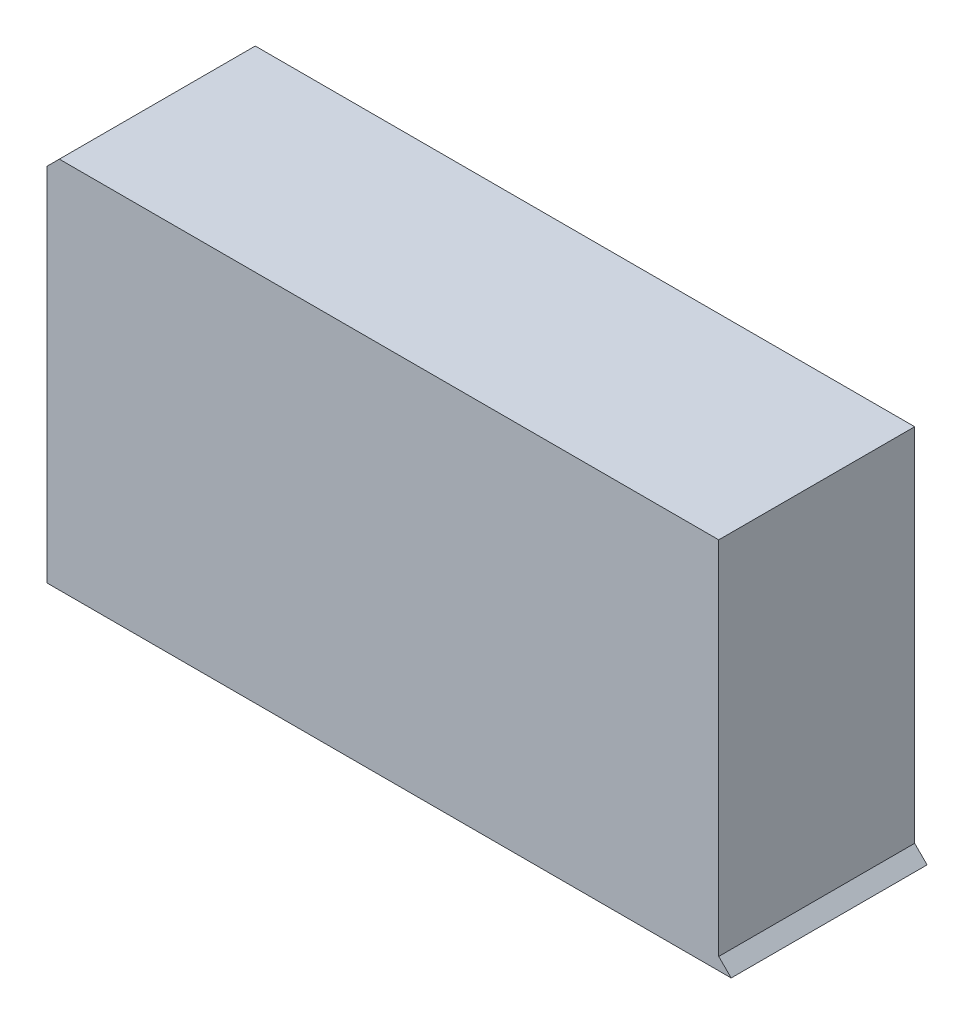
ISO-10303-21;
HEADER;
FILE_DESCRIPTION(('STEP AP214'),'2;1');
FILE_NAME('part.step','',(''),(''),'','','');
FILE_SCHEMA(('AUTOMOTIVE_DESIGN { 1 0 10303 214 1 1 1 1 }'));
ENDSEC;
DATA;
#1=APPLICATION_CONTEXT('core data for automotive mechanical design processes');
#2=APPLICATION_PROTOCOL_DEFINITION('international standard','automotive_design',2000,#1);
#3=PRODUCT_CONTEXT('',#1,'mechanical');
#4=PRODUCT('Part','Part','',(#3));
#5=PRODUCT_RELATED_PRODUCT_CATEGORY('part','',(#4));
#6=PRODUCT_DEFINITION_FORMATION('','',#4);
#7=PRODUCT_DEFINITION_CONTEXT('part definition',#1,'design');
#8=PRODUCT_DEFINITION('design','',#6,#7);
#9=PRODUCT_DEFINITION_SHAPE('','',#8);
#10=(LENGTH_UNIT() NAMED_UNIT(*) SI_UNIT(.MILLI.,.METRE.));
#11=(NAMED_UNIT(*) PLANE_ANGLE_UNIT() SI_UNIT($,.RADIAN.));
#12=(NAMED_UNIT(*) SI_UNIT($,.STERADIAN.) SOLID_ANGLE_UNIT());
#13=UNCERTAINTY_MEASURE_WITH_UNIT(LENGTH_MEASURE(1.E-05),#10,'distance_accuracy_value','');
#14=(GEOMETRIC_REPRESENTATION_CONTEXT(3) GLOBAL_UNCERTAINTY_ASSIGNED_CONTEXT((#13)) GLOBAL_UNIT_ASSIGNED_CONTEXT((#10,
#11,#12)) REPRESENTATION_CONTEXT('',''));
#15=CARTESIAN_POINT('',(0.,0.,0.));
#16=DIRECTION('',(0.,0.,1.));
#17=DIRECTION('',(1.,0.,0.));
#18=AXIS2_PLACEMENT_3D('',#15,#16,#17);
#19=CARTESIAN_POINT('',(3.4925,-1.905,0.));
#20=DIRECTION('',(-0.707106781186548,-0.707106781186548,0.));
#21=DIRECTION('',(0.707106781186548,-0.707106781186548,0.));
#22=AXIS2_PLACEMENT_3D('',#19,#20,#21);
#23=PLANE('',#22);
#24=DIRECTION('',(0.,0.,1.));
#25=VECTOR('',#24,1.);
#26=CARTESIAN_POINT('',(3.3655,-1.778,0.));
#27=LINE('',#26,#25);
#28=CARTESIAN_POINT('',(3.3655,-1.778,0.));
#29=VERTEX_POINT('',#28);
#30=CARTESIAN_POINT('',(3.3655,-1.778,2.));
#31=VERTEX_POINT('',#30);
#32=EDGE_CURVE('E70',#29,#31,#27,.T.);
#33=ORIENTED_EDGE('',*,*,#32,.T.);
#34=DIRECTION('',(0.707106781186549,-0.707106781186546,0.));
#35=VECTOR('',#34,1.);
#36=CARTESIAN_POINT('',(3.3655,-1.778,2.));
#37=LINE('',#36,#35);
#38=CARTESIAN_POINT('',(3.4925,-1.905,2.));
#39=VERTEX_POINT('',#38);
#40=EDGE_CURVE('E67',#31,#39,#37,.T.);
#41=ORIENTED_EDGE('',*,*,#40,.T.);
#42=DIRECTION('',(0.,0.,1.));
#43=VECTOR('',#42,1.);
#44=CARTESIAN_POINT('',(3.4925,-1.905,0.));
#45=LINE('',#44,#43);
#46=CARTESIAN_POINT('',(3.4925,-1.905,0.));
#47=VERTEX_POINT('',#46);
#48=EDGE_CURVE('E88',#39,#47,#45,.F.);
#49=ORIENTED_EDGE('',*,*,#48,.T.);
#50=DIRECTION('',(0.707106781186548,-0.707106781186548,0.));
#51=VECTOR('',#50,1.);
#52=CARTESIAN_POINT('',(3.4925,-1.905,0.));
#53=LINE('',#52,#51);
#54=EDGE_CURVE('E20',#29,#47,#53,.T.);
#55=ORIENTED_EDGE('',*,*,#54,.F.);
#56=EDGE_LOOP('',(#33,#41,#49,#55));
#57=FACE_BOUND('',#56,.T.);
#58=ADVANCED_FACE('F17',(#57),#23,.F.);
#59=CARTESIAN_POINT('',(3.3655,1.905,2.));
#60=DIRECTION('',(0.,0.,-1.));
#61=DIRECTION('',(-1.,0.,0.));
#62=AXIS2_PLACEMENT_3D('',#59,#60,#61);
#63=PLANE('',#62);
#64=DIRECTION('',(0.707106781186548,0.707106781186548,0.));
#65=VECTOR('',#64,1.);
#66=CARTESIAN_POINT('',(-3.3655,1.905,2.));
#67=LINE('',#66,#65);
#68=CARTESIAN_POINT('',(-3.3655,1.905,2.));
#69=VERTEX_POINT('',#68);
#70=CARTESIAN_POINT('',(-3.4925,1.778,2.));
#71=VERTEX_POINT('',#70);
#72=EDGE_CURVE('E82',#69,#71,#67,.F.);
#73=ORIENTED_EDGE('',*,*,#72,.T.);
#74=DIRECTION('',(0.,1.,0.));
#75=VECTOR('',#74,1.);
#76=CARTESIAN_POINT('',(-3.4925,1.778,2.));
#77=LINE('',#76,#75);
#78=CARTESIAN_POINT('',(-3.4925,-1.905,2.));
#79=VERTEX_POINT('',#78);
#80=EDGE_CURVE('E96',#71,#79,#77,.F.);
#81=ORIENTED_EDGE('',*,*,#80,.T.);
#82=DIRECTION('',(1.,0.,0.));
#83=VECTOR('',#82,1.);
#84=CARTESIAN_POINT('',(-3.4925,-1.905,2.));
#85=LINE('',#84,#83);
#86=EDGE_CURVE('E80',#79,#39,#85,.T.);
#87=ORIENTED_EDGE('',*,*,#86,.T.);
#88=ORIENTED_EDGE('',*,*,#40,.F.);
#89=DIRECTION('',(0.,1.,0.));
#90=VECTOR('',#89,1.);
#91=CARTESIAN_POINT('',(3.3655,-1.778,2.));
#92=LINE('',#91,#90);
#93=CARTESIAN_POINT('',(3.3655,1.905,2.));
#94=VERTEX_POINT('',#93);
#95=EDGE_CURVE('E74',#31,#94,#92,.T.);
#96=ORIENTED_EDGE('',*,*,#95,.T.);
#97=DIRECTION('',(1.,0.,0.));
#98=VECTOR('',#97,1.);
#99=CARTESIAN_POINT('',(3.3655,1.905,2.));
#100=LINE('',#99,#98);
#101=EDGE_CURVE('E97',#94,#69,#100,.F.);
#102=ORIENTED_EDGE('',*,*,#101,.T.);
#103=EDGE_LOOP('',(#73,#81,#87,#88,#96,#102));
#104=FACE_BOUND('',#103,.T.);
#105=ADVANCED_FACE('F77',(#104),#63,.F.);
#106=CARTESIAN_POINT('',(-3.3655,1.905,0.));
#107=DIRECTION('',(0.707106781186548,-0.707106781186548,0.));
#108=DIRECTION('',(0.707106781186548,0.707106781186548,0.));
#109=AXIS2_PLACEMENT_3D('',#106,#107,#108);
#110=PLANE('',#109);
#111=DIRECTION('',(0.,0.,-1.));
#112=VECTOR('',#111,1.);
#113=CARTESIAN_POINT('',(-3.4925,1.778,0.));
#114=LINE('',#113,#112);
#115=CARTESIAN_POINT('',(-3.4925,1.778,0.));
#116=VERTEX_POINT('',#115);
#117=EDGE_CURVE('E101',#116,#71,#114,.F.);
#118=ORIENTED_EDGE('',*,*,#117,.T.);
#119=ORIENTED_EDGE('',*,*,#72,.F.);
#120=DIRECTION('',(0.,0.,-1.));
#121=VECTOR('',#120,1.);
#122=CARTESIAN_POINT('',(-3.3655,1.905,0.));
#123=LINE('',#122,#121);
#124=CARTESIAN_POINT('',(-3.3655,1.905,0.));
#125=VERTEX_POINT('',#124);
#126=EDGE_CURVE('E120',#69,#125,#123,.T.);
#127=ORIENTED_EDGE('',*,*,#126,.T.);
#128=DIRECTION('',(0.707106781186548,0.707106781186548,0.));
#129=VECTOR('',#128,1.);
#130=CARTESIAN_POINT('',(-3.3655,1.905,0.));
#131=LINE('',#130,#129);
#132=EDGE_CURVE('E34',#116,#125,#131,.T.);
#133=ORIENTED_EDGE('',*,*,#132,.F.);
#134=EDGE_LOOP('',(#118,#119,#127,#133));
#135=FACE_BOUND('',#134,.T.);
#136=ADVANCED_FACE('F102',(#135),#110,.F.);
#137=CARTESIAN_POINT('',(3.3655,-1.778,0.));
#138=DIRECTION('',(-1.,0.,0.));
#139=DIRECTION('',(0.,0.,1.));
#140=AXIS2_PLACEMENT_3D('',#137,#138,#139);
#141=PLANE('',#140);
#142=DIRECTION('',(0.,0.,-1.));
#143=VECTOR('',#142,1.);
#144=CARTESIAN_POINT('',(3.3655,1.905,0.));
#145=LINE('',#144,#143);
#146=CARTESIAN_POINT('',(3.3655,1.905,0.));
#147=VERTEX_POINT('',#146);
#148=EDGE_CURVE('E85',#147,#94,#145,.F.);
#149=ORIENTED_EDGE('',*,*,#148,.T.);
#150=ORIENTED_EDGE('',*,*,#95,.F.);
#151=ORIENTED_EDGE('',*,*,#32,.F.);
#152=DIRECTION('',(0.,1.,0.));
#153=VECTOR('',#152,1.);
#154=CARTESIAN_POINT('',(3.3655,1.905,0.));
#155=LINE('',#154,#153);
#156=EDGE_CURVE('E117',#147,#29,#155,.F.);
#157=ORIENTED_EDGE('',*,*,#156,.F.);
#158=EDGE_LOOP('',(#149,#150,#151,#157));
#159=FACE_BOUND('',#158,.T.);
#160=ADVANCED_FACE('F83',(#159),#141,.F.);
#161=CARTESIAN_POINT('',(-3.4925,-1.905,0.));
#162=DIRECTION('',(0.,1.,0.));
#163=DIRECTION('',(0.,0.,1.));
#164=AXIS2_PLACEMENT_3D('',#161,#162,#163);
#165=PLANE('',#164);
#166=ORIENTED_EDGE('',*,*,#48,.F.);
#167=ORIENTED_EDGE('',*,*,#86,.F.);
#168=DIRECTION('',(0.,0.,-1.));
#169=VECTOR('',#168,1.);
#170=CARTESIAN_POINT('',(-3.4925,-1.905,0.));
#171=LINE('',#170,#169);
#172=CARTESIAN_POINT('',(-3.4925,-1.905,0.));
#173=VERTEX_POINT('',#172);
#174=EDGE_CURVE('E108',#79,#173,#171,.T.);
#175=ORIENTED_EDGE('',*,*,#174,.T.);
#176=DIRECTION('',(-1.,0.,0.));
#177=VECTOR('',#176,1.);
#178=CARTESIAN_POINT('',(3.3655,-1.905,0.));
#179=LINE('',#178,#177);
#180=EDGE_CURVE('E115',#47,#173,#179,.T.);
#181=ORIENTED_EDGE('',*,*,#180,.F.);
#182=EDGE_LOOP('',(#166,#167,#175,#181));
#183=FACE_BOUND('',#182,.T.);
#184=ADVANCED_FACE('F116',(#183),#165,.F.);
#185=CARTESIAN_POINT('',(-3.4925,1.778,0.));
#186=DIRECTION('',(1.,0.,0.));
#187=DIRECTION('',(0.,0.,-1.));
#188=AXIS2_PLACEMENT_3D('',#185,#186,#187);
#189=PLANE('',#188);
#190=ORIENTED_EDGE('',*,*,#174,.F.);
#191=ORIENTED_EDGE('',*,*,#80,.F.);
#192=ORIENTED_EDGE('',*,*,#117,.F.);
#193=DIRECTION('',(0.,1.,0.));
#194=VECTOR('',#193,1.);
#195=CARTESIAN_POINT('',(-3.4925,1.905,0.));
#196=LINE('',#195,#194);
#197=EDGE_CURVE('E26',#173,#116,#196,.T.);
#198=ORIENTED_EDGE('',*,*,#197,.F.);
#199=EDGE_LOOP('',(#190,#191,#192,#198));
#200=FACE_BOUND('',#199,.T.);
#201=ADVANCED_FACE('F107',(#200),#189,.F.);
#202=CARTESIAN_POINT('',(3.3655,1.905,0.));
#203=DIRECTION('',(0.,-1.,0.));
#204=DIRECTION('',(0.,0.,-1.));
#205=AXIS2_PLACEMENT_3D('',#202,#203,#204);
#206=PLANE('',#205);
#207=ORIENTED_EDGE('',*,*,#126,.F.);
#208=ORIENTED_EDGE('',*,*,#101,.F.);
#209=ORIENTED_EDGE('',*,*,#148,.F.);
#210=DIRECTION('',(-1.,0.,0.));
#211=VECTOR('',#210,1.);
#212=CARTESIAN_POINT('',(3.3655,1.905,0.));
#213=LINE('',#212,#211);
#214=EDGE_CURVE('E11',#125,#147,#213,.F.);
#215=ORIENTED_EDGE('',*,*,#214,.F.);
#216=EDGE_LOOP('',(#207,#208,#209,#215));
#217=FACE_BOUND('',#216,.T.);
#218=ADVANCED_FACE('F126',(#217),#206,.F.);
#219=CARTESIAN_POINT('',(3.3655,1.905,0.));
#220=DIRECTION('',(0.,0.,-1.));
#221=DIRECTION('',(-1.,0.,0.));
#222=AXIS2_PLACEMENT_3D('',#219,#220,#221);
#223=PLANE('',#222);
#224=ORIENTED_EDGE('',*,*,#132,.T.);
#225=ORIENTED_EDGE('',*,*,#214,.T.);
#226=ORIENTED_EDGE('',*,*,#156,.T.);
#227=ORIENTED_EDGE('',*,*,#54,.T.);
#228=ORIENTED_EDGE('',*,*,#180,.T.);
#229=ORIENTED_EDGE('',*,*,#197,.T.);
#230=EDGE_LOOP('',(#224,#225,#226,#227,#228,#229));
#231=FACE_BOUND('',#230,.T.);
#232=ADVANCED_FACE('F127',(#231),#223,.T.);
#233=CLOSED_SHELL('',(#58,#105,#136,#160,#184,#201,#218,#232));
#234=MANIFOLD_SOLID_BREP('B1',#233);
#235=ADVANCED_BREP_SHAPE_REPRESENTATION('',(#18,#234),#14);
#236=SHAPE_DEFINITION_REPRESENTATION(#9,#235);
ENDSEC;
END-ISO-10303-21;
